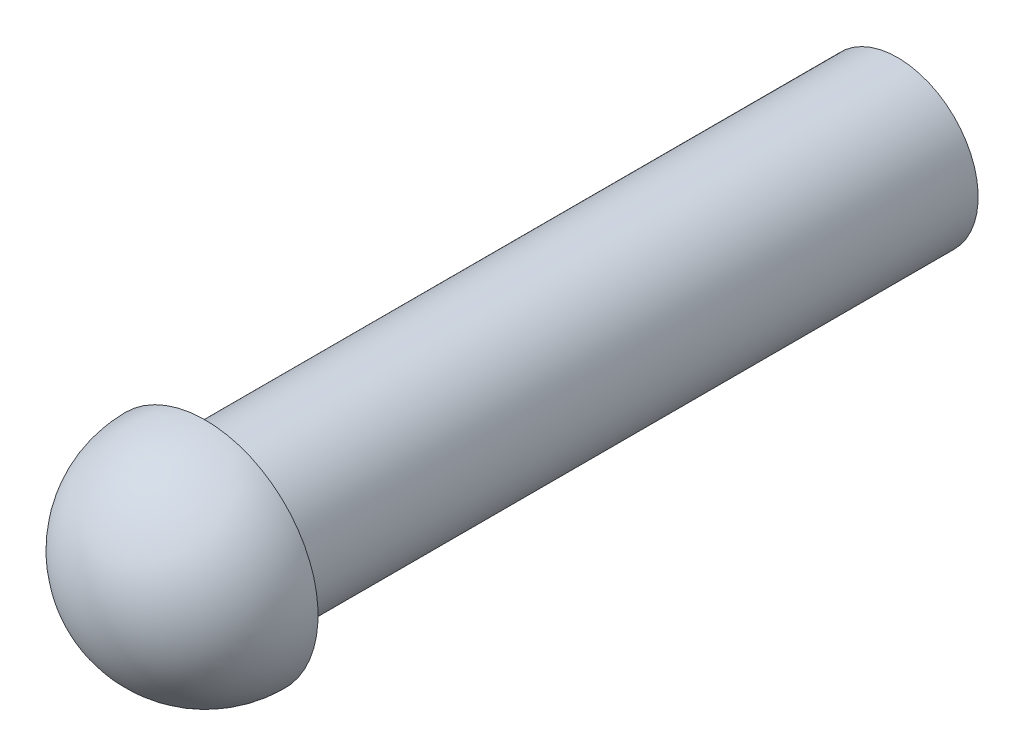
ISO-10303-21;
HEADER;
FILE_DESCRIPTION(('STEP AP214'),'2;1');
FILE_NAME('part.step','',(''),(''),'','','');
FILE_SCHEMA(('AUTOMOTIVE_DESIGN { 1 0 10303 214 1 1 1 1 }'));
ENDSEC;
DATA;
#1=APPLICATION_CONTEXT('core data for automotive mechanical design processes');
#2=APPLICATION_PROTOCOL_DEFINITION('international standard','automotive_design',2000,#1);
#3=PRODUCT_CONTEXT('',#1,'mechanical');
#4=PRODUCT('Part','Part','',(#3));
#5=PRODUCT_RELATED_PRODUCT_CATEGORY('part','',(#4));
#6=PRODUCT_DEFINITION_FORMATION('','',#4);
#7=PRODUCT_DEFINITION_CONTEXT('part definition',#1,'design');
#8=PRODUCT_DEFINITION('design','',#6,#7);
#9=PRODUCT_DEFINITION_SHAPE('','',#8);
#10=(LENGTH_UNIT() NAMED_UNIT(*) SI_UNIT(.MILLI.,.METRE.));
#11=(NAMED_UNIT(*) PLANE_ANGLE_UNIT() SI_UNIT($,.RADIAN.));
#12=(NAMED_UNIT(*) SI_UNIT($,.STERADIAN.) SOLID_ANGLE_UNIT());
#13=UNCERTAINTY_MEASURE_WITH_UNIT(LENGTH_MEASURE(1.E-05),#10,'distance_accuracy_value','');
#14=(GEOMETRIC_REPRESENTATION_CONTEXT(3) GLOBAL_UNCERTAINTY_ASSIGNED_CONTEXT((#13)) GLOBAL_UNIT_ASSIGNED_CONTEXT((#10,
#11,#12)) REPRESENTATION_CONTEXT('',''));
#15=CARTESIAN_POINT('',(0.,0.,0.));
#16=DIRECTION('',(0.,0.,1.));
#17=DIRECTION('',(1.,0.,0.));
#18=AXIS2_PLACEMENT_3D('',#15,#16,#17);
#19=CARTESIAN_POINT('',(117.962241517644,79.2774216037134,-43.0000000000008));
#20=DIRECTION('',(0.,0.,1.));
#21=DIRECTION('',(1.,0.,0.));
#22=AXIS2_PLACEMENT_3D('',#19,#20,#21);
#23=CYLINDRICAL_SURFACE('',#22,4.99999999999999);
#24=CARTESIAN_POINT('',(117.962241517644,79.2774216037134,-43.0000000000008));
#25=DIRECTION('',(0.,0.,-1.));
#26=DIRECTION('',(-1.,0.,0.));
#27=AXIS2_PLACEMENT_3D('',#24,#25,#26);
#28=CIRCLE('',#27,4.99999999999999);
#29=CARTESIAN_POINT('',(112.962241517644,79.2774216037134,-43.0000000000008));
#30=VERTEX_POINT('',#29);
#31=EDGE_CURVE('E10',#30,#30,#28,.T.);
#32=ORIENTED_EDGE('',*,*,#31,.F.);
#33=EDGE_LOOP('',(#32));
#34=FACE_BOUND('',#33,.T.);
#35=CARTESIAN_POINT('',(117.962241517645,79.2774216037134,0.));
#36=DIRECTION('',(0.,0.,-1.));
#37=DIRECTION('',(-1.,0.,0.));
#38=AXIS2_PLACEMENT_3D('',#35,#36,#37);
#39=CIRCLE('',#38,4.99999999999999);
#40=CARTESIAN_POINT('',(112.962241517645,79.2774216037134,0.));
#41=VERTEX_POINT('',#40);
#42=EDGE_CURVE('E45',#41,#41,#39,.T.);
#43=ORIENTED_EDGE('',*,*,#42,.T.);
#44=EDGE_LOOP('',(#43));
#45=FACE_BOUND('',#44,.T.);
#46=ADVANCED_FACE('F39',(#34,#45),#23,.T.);
#47=CARTESIAN_POINT('',(117.962241517644,79.2774216037134,-43.0000000000008));
#48=DIRECTION('',(0.,0.,-1.));
#49=DIRECTION('',(-1.,0.,0.));
#50=AXIS2_PLACEMENT_3D('',#47,#48,#49);
#51=PLANE('',#50);
#52=ORIENTED_EDGE('',*,*,#31,.T.);
#53=EDGE_LOOP('',(#52));
#54=FACE_BOUND('',#53,.T.);
#55=ADVANCED_FACE('F60',(#54),#51,.T.);
#56=CARTESIAN_POINT('',(117.962241517644,79.2774216037134,0.));
#57=DIRECTION('',(0.,1.,0.));
#58=DIRECTION('',(-1.,0.,0.));
#59=AXIS2_PLACEMENT_3D('',#56,#57,#58);
#60=SPHERICAL_SURFACE('',#59,7.);
#61=CARTESIAN_POINT('',(117.962241517644,79.2774216037134,0.));
#62=DIRECTION('',(0.,0.,-1.));
#63=DIRECTION('',(-1.,0.,0.));
#64=AXIS2_PLACEMENT_3D('',#61,#62,#63);
#65=SPHERICAL_SURFACE('',#64,7.);
#66=CARTESIAN_POINT('',(117.962241517644,79.2774216037134,0.));
#67=DIRECTION('',(0.,0.,-1.));
#68=DIRECTION('',(-1.,0.,0.));
#69=AXIS2_PLACEMENT_3D('',#66,#67,#68);
#70=CIRCLE('',#69,7.);
#71=CARTESIAN_POINT('',(110.962241517644,79.2774216037134,0.));
#72=VERTEX_POINT('',#71);
#73=EDGE_CURVE('E49',#72,#72,#70,.T.);
#74=ORIENTED_EDGE('',*,*,#73,.F.);
#75=EDGE_LOOP('',(#74));
#76=FACE_BOUND('',#75,.T.);
#77=ADVANCED_FACE('F58',(#76),#65,.T.);
#78=CARTESIAN_POINT('',(235.924483035289,0.,8.23725929893924E-13));
#79=DIRECTION('',(0.,0.,-1.));
#80=DIRECTION('',(-1.,0.,0.));
#81=AXIS2_PLACEMENT_3D('',#78,#79,#80);
#82=PLANE('',#81);
#83=ORIENTED_EDGE('',*,*,#42,.F.);
#84=EDGE_LOOP('',(#83));
#85=FACE_BOUND('',#84,.T.);
#86=ORIENTED_EDGE('',*,*,#73,.T.);
#87=EDGE_LOOP('',(#86));
#88=FACE_BOUND('',#87,.T.);
#89=ADVANCED_FACE('F56',(#85,#88),#82,.T.);
#90=CLOSED_SHELL('',(#46,#55,#77,#89));
#91=MANIFOLD_SOLID_BREP('B2',#90);
#92=ADVANCED_BREP_SHAPE_REPRESENTATION('',(#18,#91),#14);
#93=SHAPE_DEFINITION_REPRESENTATION(#9,#92);
ENDSEC;
END-ISO-10303-21;
